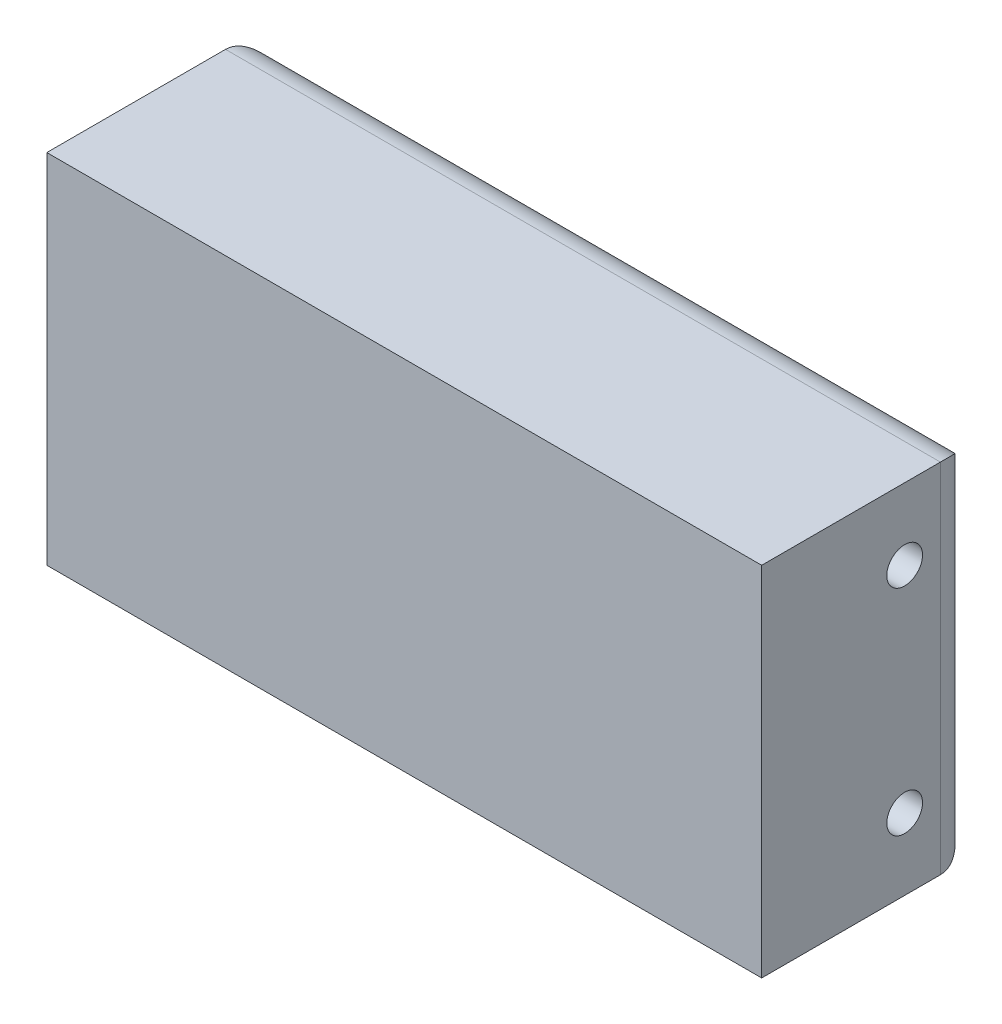
ISO-10303-21;
HEADER;
FILE_DESCRIPTION(('STEP AP214'),'2;1');
FILE_NAME('part.step','',(''),(''),'','','');
FILE_SCHEMA(('AUTOMOTIVE_DESIGN { 1 0 10303 214 1 1 1 1 }'));
ENDSEC;
DATA;
#1=APPLICATION_CONTEXT('core data for automotive mechanical design processes');
#2=APPLICATION_PROTOCOL_DEFINITION('international standard','automotive_design',2000,#1);
#3=PRODUCT_CONTEXT('',#1,'mechanical');
#4=PRODUCT('Part','Part','',(#3));
#5=PRODUCT_RELATED_PRODUCT_CATEGORY('part','',(#4));
#6=PRODUCT_DEFINITION_FORMATION('','',#4);
#7=PRODUCT_DEFINITION_CONTEXT('part definition',#1,'design');
#8=PRODUCT_DEFINITION('design','',#6,#7);
#9=PRODUCT_DEFINITION_SHAPE('','',#8);
#10=(LENGTH_UNIT() NAMED_UNIT(*) SI_UNIT(.MILLI.,.METRE.));
#11=(NAMED_UNIT(*) PLANE_ANGLE_UNIT() SI_UNIT($,.RADIAN.));
#12=(NAMED_UNIT(*) SI_UNIT($,.STERADIAN.) SOLID_ANGLE_UNIT());
#13=UNCERTAINTY_MEASURE_WITH_UNIT(LENGTH_MEASURE(1.E-05),#10,'distance_accuracy_value','');
#14=(GEOMETRIC_REPRESENTATION_CONTEXT(3) GLOBAL_UNCERTAINTY_ASSIGNED_CONTEXT((#13)) GLOBAL_UNIT_ASSIGNED_CONTEXT((#10,
#11,#12)) REPRESENTATION_CONTEXT('',''));
#15=CARTESIAN_POINT('',(0.,0.,0.));
#16=DIRECTION('',(0.,0.,1.));
#17=DIRECTION('',(1.,0.,0.));
#18=AXIS2_PLACEMENT_3D('',#15,#16,#17);
#19=CARTESIAN_POINT('',(50.,25.,30.));
#20=DIRECTION('',(-1.,0.,0.));
#21=DIRECTION('',(0.,-1.,0.));
#22=AXIS2_PLACEMENT_3D('',#19,#20,#21);
#23=PLANE('',#22);
#24=CARTESIAN_POINT('',(50.,-15.,10.));
#25=DIRECTION('',(1.,0.,0.));
#26=DIRECTION('',(0.,1.,0.));
#27=AXIS2_PLACEMENT_3D('',#24,#25,#26);
#28=CIRCLE('',#27,2.5);
#29=CARTESIAN_POINT('',(50.,-12.5,10.));
#30=VERTEX_POINT('',#29);
#31=EDGE_CURVE('E134',#30,#30,#28,.T.);
#32=ORIENTED_EDGE('',*,*,#31,.F.);
#33=EDGE_LOOP('',(#32));
#34=FACE_BOUND('',#33,.T.);
#35=CARTESIAN_POINT('',(50.,15.,10.));
#36=DIRECTION('',(1.,0.,0.));
#37=DIRECTION('',(0.,1.,0.));
#38=AXIS2_PLACEMENT_3D('',#35,#36,#37);
#39=CIRCLE('',#38,2.5);
#40=CARTESIAN_POINT('',(50.,17.5,10.));
#41=VERTEX_POINT('',#40);
#42=EDGE_CURVE('E133',#41,#41,#39,.T.);
#43=ORIENTED_EDGE('',*,*,#42,.F.);
#44=EDGE_LOOP('',(#43));
#45=FACE_BOUND('',#44,.T.);
#46=DIRECTION('',(0.,0.,-1.));
#47=VECTOR('',#46,1.);
#48=CARTESIAN_POINT('',(50.,-25.,30.));
#49=LINE('',#48,#47);
#50=CARTESIAN_POINT('',(50.,-25.,30.));
#51=VERTEX_POINT('',#50);
#52=CARTESIAN_POINT('',(50.,-25.,5.));
#53=VERTEX_POINT('',#52);
#54=EDGE_CURVE('E151',#51,#53,#49,.T.);
#55=ORIENTED_EDGE('',*,*,#54,.T.);
#56=DIRECTION('',(0.,1.,0.));
#57=VECTOR('',#56,1.);
#58=CARTESIAN_POINT('',(50.,25.,5.));
#59=LINE('',#58,#57);
#60=CARTESIAN_POINT('',(50.,25.,5.));
#61=VERTEX_POINT('',#60);
#62=EDGE_CURVE('E163',#53,#61,#59,.T.);
#63=ORIENTED_EDGE('',*,*,#62,.T.);
#64=DIRECTION('',(0.,0.,-1.));
#65=VECTOR('',#64,1.);
#66=CARTESIAN_POINT('',(50.,25.,30.));
#67=LINE('',#66,#65);
#68=CARTESIAN_POINT('',(50.,25.,30.));
#69=VERTEX_POINT('',#68);
#70=EDGE_CURVE('E160',#69,#61,#67,.T.);
#71=ORIENTED_EDGE('',*,*,#70,.F.);
#72=DIRECTION('',(0.,1.,0.));
#73=VECTOR('',#72,1.);
#74=CARTESIAN_POINT('',(50.,25.,30.));
#75=LINE('',#74,#73);
#76=EDGE_CURVE('E140',#51,#69,#75,.T.);
#77=ORIENTED_EDGE('',*,*,#76,.F.);
#78=EDGE_LOOP('',(#55,#63,#71,#77));
#79=FACE_BOUND('',#78,.T.);
#80=ADVANCED_FACE('F35',(#34,#45,#79),#23,.F.);
#81=CARTESIAN_POINT('',(-50.,25.,30.));
#82=DIRECTION('',(0.,-1.,0.));
#83=DIRECTION('',(0.,0.,-1.));
#84=AXIS2_PLACEMENT_3D('',#81,#82,#83);
#85=PLANE('',#84);
#86=ORIENTED_EDGE('',*,*,#70,.T.);
#87=DIRECTION('',(-1.,0.,0.));
#88=VECTOR('',#87,1.);
#89=CARTESIAN_POINT('',(-50.,25.,5.));
#90=LINE('',#89,#88);
#91=CARTESIAN_POINT('',(-50.,25.,5.));
#92=VERTEX_POINT('',#91);
#93=EDGE_CURVE('E11',#61,#92,#90,.T.);
#94=ORIENTED_EDGE('',*,*,#93,.T.);
#95=DIRECTION('',(0.,0.,-1.));
#96=VECTOR('',#95,1.);
#97=CARTESIAN_POINT('',(-50.,25.,30.));
#98=LINE('',#97,#96);
#99=CARTESIAN_POINT('',(-50.,25.,30.));
#100=VERTEX_POINT('',#99);
#101=EDGE_CURVE('E157',#100,#92,#98,.T.);
#102=ORIENTED_EDGE('',*,*,#101,.F.);
#103=DIRECTION('',(-1.,0.,0.));
#104=VECTOR('',#103,1.);
#105=CARTESIAN_POINT('',(-50.,25.,30.));
#106=LINE('',#105,#104);
#107=EDGE_CURVE('E145',#69,#100,#106,.T.);
#108=ORIENTED_EDGE('',*,*,#107,.F.);
#109=EDGE_LOOP('',(#86,#94,#102,#108));
#110=FACE_BOUND('',#109,.T.);
#111=ADVANCED_FACE('F210',(#110),#85,.F.);
#112=CARTESIAN_POINT('',(-50.,25.,30.));
#113=DIRECTION('',(1.,0.,0.));
#114=DIRECTION('',(0.,1.,0.));
#115=AXIS2_PLACEMENT_3D('',#112,#113,#114);
#116=PLANE('',#115);
#117=CARTESIAN_POINT('',(-50.,-15.,10.));
#118=DIRECTION('',(1.,0.,0.));
#119=DIRECTION('',(0.,1.,0.));
#120=AXIS2_PLACEMENT_3D('',#117,#118,#119);
#121=CIRCLE('',#120,2.5);
#122=CARTESIAN_POINT('',(-50.,-12.5,10.));
#123=VERTEX_POINT('',#122);
#124=EDGE_CURVE('E130',#123,#123,#121,.T.);
#125=ORIENTED_EDGE('',*,*,#124,.T.);
#126=EDGE_LOOP('',(#125));
#127=FACE_BOUND('',#126,.T.);
#128=CARTESIAN_POINT('',(-50.,15.,10.));
#129=DIRECTION('',(1.,0.,0.));
#130=DIRECTION('',(0.,1.,0.));
#131=AXIS2_PLACEMENT_3D('',#128,#129,#130);
#132=CIRCLE('',#131,2.5);
#133=CARTESIAN_POINT('',(-50.,17.5,10.));
#134=VERTEX_POINT('',#133);
#135=EDGE_CURVE('E137',#134,#134,#132,.T.);
#136=ORIENTED_EDGE('',*,*,#135,.T.);
#137=EDGE_LOOP('',(#136));
#138=FACE_BOUND('',#137,.T.);
#139=ORIENTED_EDGE('',*,*,#101,.T.);
#140=DIRECTION('',(0.,-1.,0.));
#141=VECTOR('',#140,1.);
#142=CARTESIAN_POINT('',(-50.,25.,5.));
#143=LINE('',#142,#141);
#144=CARTESIAN_POINT('',(-50.,-25.,5.));
#145=VERTEX_POINT('',#144);
#146=EDGE_CURVE('E44',#92,#145,#143,.T.);
#147=ORIENTED_EDGE('',*,*,#146,.T.);
#148=DIRECTION('',(0.,0.,-1.));
#149=VECTOR('',#148,1.);
#150=CARTESIAN_POINT('',(-50.,-25.,30.));
#151=LINE('',#150,#149);
#152=CARTESIAN_POINT('',(-50.,-25.,30.));
#153=VERTEX_POINT('',#152);
#154=EDGE_CURVE('E154',#153,#145,#151,.T.);
#155=ORIENTED_EDGE('',*,*,#154,.F.);
#156=DIRECTION('',(0.,-1.,0.));
#157=VECTOR('',#156,1.);
#158=CARTESIAN_POINT('',(-50.,25.,30.));
#159=LINE('',#158,#157);
#160=EDGE_CURVE('E147',#100,#153,#159,.T.);
#161=ORIENTED_EDGE('',*,*,#160,.F.);
#162=EDGE_LOOP('',(#139,#147,#155,#161));
#163=FACE_BOUND('',#162,.T.);
#164=ADVANCED_FACE('F219',(#127,#138,#163),#116,.F.);
#165=CARTESIAN_POINT('',(-50.,-25.,30.));
#166=DIRECTION('',(0.,1.,0.));
#167=DIRECTION('',(0.,0.,1.));
#168=AXIS2_PLACEMENT_3D('',#165,#166,#167);
#169=PLANE('',#168);
#170=ORIENTED_EDGE('',*,*,#154,.T.);
#171=DIRECTION('',(1.,0.,0.));
#172=VECTOR('',#171,1.);
#173=CARTESIAN_POINT('',(-50.,-25.,5.));
#174=LINE('',#173,#172);
#175=EDGE_CURVE('E175',#145,#53,#174,.T.);
#176=ORIENTED_EDGE('',*,*,#175,.T.);
#177=ORIENTED_EDGE('',*,*,#54,.F.);
#178=DIRECTION('',(1.,0.,0.));
#179=VECTOR('',#178,1.);
#180=CARTESIAN_POINT('',(-50.,-25.,30.));
#181=LINE('',#180,#179);
#182=EDGE_CURVE('E149',#153,#51,#181,.T.);
#183=ORIENTED_EDGE('',*,*,#182,.F.);
#184=EDGE_LOOP('',(#170,#176,#177,#183));
#185=FACE_BOUND('',#184,.T.);
#186=ADVANCED_FACE('F217',(#185),#169,.F.);
#187=CARTESIAN_POINT('',(0.,0.,30.));
#188=DIRECTION('',(0.,0.,1.));
#189=DIRECTION('',(1.,0.,0.));
#190=AXIS2_PLACEMENT_3D('',#187,#188,#189);
#191=PLANE('',#190);
#192=ORIENTED_EDGE('',*,*,#76,.T.);
#193=ORIENTED_EDGE('',*,*,#107,.T.);
#194=ORIENTED_EDGE('',*,*,#160,.T.);
#195=ORIENTED_EDGE('',*,*,#182,.T.);
#196=EDGE_LOOP('',(#192,#193,#194,#195));
#197=FACE_BOUND('',#196,.T.);
#198=ADVANCED_FACE('F213',(#197),#191,.T.);
#199=CARTESIAN_POINT('',(0.,0.,0.));
#200=DIRECTION('',(0.,0.,1.));
#201=DIRECTION('',(1.,0.,0.));
#202=AXIS2_PLACEMENT_3D('',#199,#200,#201);
#203=PLANE('',#202);
#204=CARTESIAN_POINT('',(0.,15.,0.));
#205=DIRECTION('',(0.,0.,-1.));
#206=DIRECTION('',(-1.,0.,0.));
#207=AXIS2_PLACEMENT_3D('',#204,#205,#206);
#208=CIRCLE('',#207,2.5);
#209=CARTESIAN_POINT('',(-2.49999999999998,15.,0.));
#210=VERTEX_POINT('',#209);
#211=EDGE_CURVE('E111',#210,#210,#208,.T.);
#212=ORIENTED_EDGE('',*,*,#211,.F.);
#213=EDGE_LOOP('',(#212));
#214=FACE_BOUND('',#213,.T.);
#215=CARTESIAN_POINT('',(-30.,15.,0.));
#216=DIRECTION('',(0.,0.,-1.));
#217=DIRECTION('',(-1.,0.,0.));
#218=AXIS2_PLACEMENT_3D('',#215,#216,#217);
#219=CIRCLE('',#218,2.5);
#220=CARTESIAN_POINT('',(-32.5,15.,0.));
#221=VERTEX_POINT('',#220);
#222=EDGE_CURVE('E117',#221,#221,#219,.T.);
#223=ORIENTED_EDGE('',*,*,#222,.F.);
#224=EDGE_LOOP('',(#223));
#225=FACE_BOUND('',#224,.T.);
#226=CARTESIAN_POINT('',(30.,15.,0.));
#227=DIRECTION('',(0.,0.,-1.));
#228=DIRECTION('',(-1.,0.,0.));
#229=AXIS2_PLACEMENT_3D('',#226,#227,#228);
#230=CIRCLE('',#229,2.5);
#231=CARTESIAN_POINT('',(27.5,15.,0.));
#232=VERTEX_POINT('',#231);
#233=EDGE_CURVE('E123',#232,#232,#230,.T.);
#234=ORIENTED_EDGE('',*,*,#233,.F.);
#235=EDGE_LOOP('',(#234));
#236=FACE_BOUND('',#235,.T.);
#237=DIRECTION('',(-1.,0.,0.));
#238=VECTOR('',#237,1.);
#239=CARTESIAN_POINT('',(0.,20.,0.));
#240=LINE('',#239,#238);
#241=CARTESIAN_POINT('',(-45.,20.,0.));
#242=VERTEX_POINT('',#241);
#243=CARTESIAN_POINT('',(45.,20.,0.));
#244=VERTEX_POINT('',#243);
#245=EDGE_CURVE('E166',#242,#244,#240,.F.);
#246=ORIENTED_EDGE('',*,*,#245,.T.);
#247=DIRECTION('',(0.,1.,0.));
#248=VECTOR('',#247,1.);
#249=CARTESIAN_POINT('',(45.,0.,0.));
#250=LINE('',#249,#248);
#251=CARTESIAN_POINT('',(45.,-20.,0.));
#252=VERTEX_POINT('',#251);
#253=EDGE_CURVE('E172',#244,#252,#250,.F.);
#254=ORIENTED_EDGE('',*,*,#253,.T.);
#255=DIRECTION('',(1.,0.,0.));
#256=VECTOR('',#255,1.);
#257=CARTESIAN_POINT('',(0.,-20.,0.));
#258=LINE('',#257,#256);
#259=CARTESIAN_POINT('',(-45.,-20.,0.));
#260=VERTEX_POINT('',#259);
#261=EDGE_CURVE('E170',#252,#260,#258,.F.);
#262=ORIENTED_EDGE('',*,*,#261,.T.);
#263=DIRECTION('',(0.,-1.,0.));
#264=VECTOR('',#263,1.);
#265=CARTESIAN_POINT('',(-45.,0.,0.));
#266=LINE('',#265,#264);
#267=EDGE_CURVE('E168',#260,#242,#266,.F.);
#268=ORIENTED_EDGE('',*,*,#267,.T.);
#269=EDGE_LOOP('',(#246,#254,#262,#268));
#270=FACE_BOUND('',#269,.T.);
#271=ADVANCED_FACE('F197',(#214,#225,#236,#270),#203,.F.);
#272=CARTESIAN_POINT('',(-50.,15.,10.));
#273=DIRECTION('',(1.,0.,0.));
#274=DIRECTION('',(0.,1.,0.));
#275=AXIS2_PLACEMENT_3D('',#272,#273,#274);
#276=CYLINDRICAL_SURFACE('',#275,2.5);
#277=CARTESIAN_POINT('',(0.,15.,10.));
#278=DIRECTION('',(-0.707106781186547,0.,-0.707106781186547));
#279=DIRECTION('',(0.707106781186547,0.,-0.707106781186547));
#280=AXIS2_PLACEMENT_3D('',#277,#278,#279);
#281=ELLIPSE('',#280,3.53553390593274,2.5);
#282=CARTESIAN_POINT('',(0.,12.5,10.));
#283=VERTEX_POINT('',#282);
#284=CARTESIAN_POINT('',(0.,17.5,10.));
#285=VERTEX_POINT('',#284);
#286=EDGE_CURVE('E104',#283,#285,#281,.F.);
#287=ORIENTED_EDGE('',*,*,#286,.F.);
#288=CARTESIAN_POINT('',(0.,15.,10.));
#289=DIRECTION('',(0.707106781186547,0.,-0.707106781186547));
#290=DIRECTION('',(-0.707106781186547,0.,-0.707106781186547));
#291=AXIS2_PLACEMENT_3D('',#288,#289,#290);
#292=ELLIPSE('',#291,3.53553390593274,2.5);
#293=EDGE_CURVE('E51',#285,#283,#292,.F.);
#294=ORIENTED_EDGE('',*,*,#293,.F.);
#295=EDGE_LOOP('',(#287,#294));
#296=FACE_BOUND('',#295,.T.);
#297=CARTESIAN_POINT('',(-30.,15.,10.));
#298=DIRECTION('',(-0.707106781186547,0.,-0.707106781186547));
#299=DIRECTION('',(0.707106781186547,0.,-0.707106781186547));
#300=AXIS2_PLACEMENT_3D('',#297,#298,#299);
#301=ELLIPSE('',#300,3.53553390593274,2.5);
#302=CARTESIAN_POINT('',(-30.,12.5,10.));
#303=VERTEX_POINT('',#302);
#304=CARTESIAN_POINT('',(-30.,17.5,10.));
#305=VERTEX_POINT('',#304);
#306=EDGE_CURVE('E114',#303,#305,#301,.F.);
#307=ORIENTED_EDGE('',*,*,#306,.F.);
#308=CARTESIAN_POINT('',(-30.,15.,10.));
#309=DIRECTION('',(0.707106781186547,0.,-0.707106781186547));
#310=DIRECTION('',(-0.707106781186547,0.,-0.707106781186547));
#311=AXIS2_PLACEMENT_3D('',#308,#309,#310);
#312=ELLIPSE('',#311,3.53553390593274,2.5);
#313=EDGE_CURVE('E58',#305,#303,#312,.F.);
#314=ORIENTED_EDGE('',*,*,#313,.F.);
#315=EDGE_LOOP('',(#307,#314));
#316=FACE_BOUND('',#315,.T.);
#317=CARTESIAN_POINT('',(30.,15.,10.));
#318=DIRECTION('',(-0.707106781186547,0.,-0.707106781186547));
#319=DIRECTION('',(0.707106781186547,0.,-0.707106781186547));
#320=AXIS2_PLACEMENT_3D('',#317,#318,#319);
#321=ELLIPSE('',#320,3.53553390593274,2.5);
#322=CARTESIAN_POINT('',(30.,12.5,10.));
#323=VERTEX_POINT('',#322);
#324=CARTESIAN_POINT('',(30.,17.5,10.));
#325=VERTEX_POINT('',#324);
#326=EDGE_CURVE('E120',#323,#325,#321,.F.);
#327=ORIENTED_EDGE('',*,*,#326,.F.);
#328=CARTESIAN_POINT('',(30.,15.,10.));
#329=DIRECTION('',(0.707106781186547,0.,-0.707106781186547));
#330=DIRECTION('',(-0.707106781186547,0.,-0.707106781186547));
#331=AXIS2_PLACEMENT_3D('',#328,#329,#330);
#332=ELLIPSE('',#331,3.53553390593274,2.5);
#333=EDGE_CURVE('E127',#325,#323,#332,.F.);
#334=ORIENTED_EDGE('',*,*,#333,.F.);
#335=EDGE_LOOP('',(#327,#334));
#336=FACE_BOUND('',#335,.T.);
#337=ORIENTED_EDGE('',*,*,#135,.F.);
#338=EDGE_LOOP('',(#337));
#339=FACE_BOUND('',#338,.T.);
#340=ORIENTED_EDGE('',*,*,#42,.T.);
#341=EDGE_LOOP('',(#340));
#342=FACE_BOUND('',#341,.T.);
#343=ADVANCED_FACE('F109',(#296,#316,#336,#339,#342),#276,.F.);
#344=CARTESIAN_POINT('',(-50.,-15.,10.));
#345=DIRECTION('',(1.,0.,0.));
#346=DIRECTION('',(0.,1.,0.));
#347=AXIS2_PLACEMENT_3D('',#344,#345,#346);
#348=CYLINDRICAL_SURFACE('',#347,2.5);
#349=ORIENTED_EDGE('',*,*,#124,.F.);
#350=EDGE_LOOP('',(#349));
#351=FACE_BOUND('',#350,.T.);
#352=ORIENTED_EDGE('',*,*,#31,.T.);
#353=EDGE_LOOP('',(#352));
#354=FACE_BOUND('',#353,.T.);
#355=ADVANCED_FACE('F246',(#351,#354),#348,.F.);
#356=CARTESIAN_POINT('',(-45.,25.,5.));
#357=DIRECTION('',(0.,-1.,0.));
#358=DIRECTION('',(1.,0.,0.));
#359=AXIS2_PLACEMENT_3D('',#356,#357,#358);
#360=CYLINDRICAL_SURFACE('',#359,5.);
#361=CARTESIAN_POINT('',(-45.,20.,5.));
#362=DIRECTION('',(-0.707106781186547,-0.707106781186548,0.));
#363=DIRECTION('',(-0.707106781186548,0.707106781186547,0.));
#364=AXIS2_PLACEMENT_3D('',#361,#362,#363);
#365=ELLIPSE('',#364,7.07106781186548,5.);
#366=EDGE_CURVE('E180',#242,#92,#365,.F.);
#367=ORIENTED_EDGE('',*,*,#366,.F.);
#368=ORIENTED_EDGE('',*,*,#267,.F.);
#369=CARTESIAN_POINT('',(-45.,-20.,5.));
#370=DIRECTION('',(0.707106781186548,-0.707106781186547,0.));
#371=DIRECTION('',(-0.707106781186547,-0.707106781186548,0.));
#372=AXIS2_PLACEMENT_3D('',#369,#370,#371);
#373=ELLIPSE('',#372,7.07106781186547,5.);
#374=EDGE_CURVE('E39',#145,#260,#373,.T.);
#375=ORIENTED_EDGE('',*,*,#374,.F.);
#376=ORIENTED_EDGE('',*,*,#146,.F.);
#377=EDGE_LOOP('',(#367,#368,#375,#376));
#378=FACE_BOUND('',#377,.T.);
#379=ADVANCED_FACE('F37',(#378),#360,.T.);
#380=CARTESIAN_POINT('',(-50.,-20.,5.));
#381=DIRECTION('',(1.,0.,0.));
#382=DIRECTION('',(0.,0.,-1.));
#383=AXIS2_PLACEMENT_3D('',#380,#381,#382);
#384=CYLINDRICAL_SURFACE('',#383,5.);
#385=ORIENTED_EDGE('',*,*,#374,.T.);
#386=ORIENTED_EDGE('',*,*,#261,.F.);
#387=CARTESIAN_POINT('',(45.,-20.,5.));
#388=DIRECTION('',(0.707106781186547,0.707106781186548,0.));
#389=DIRECTION('',(0.707106781186548,-0.707106781186547,0.));
#390=AXIS2_PLACEMENT_3D('',#387,#388,#389);
#391=ELLIPSE('',#390,7.07106781186548,5.);
#392=EDGE_CURVE('E179',#53,#252,#391,.T.);
#393=ORIENTED_EDGE('',*,*,#392,.F.);
#394=ORIENTED_EDGE('',*,*,#175,.F.);
#395=EDGE_LOOP('',(#385,#386,#393,#394));
#396=FACE_BOUND('',#395,.T.);
#397=ADVANCED_FACE('F191',(#396),#384,.T.);
#398=CARTESIAN_POINT('',(-50.,20.,5.));
#399=DIRECTION('',(-1.,0.,0.));
#400=DIRECTION('',(0.,0.,1.));
#401=AXIS2_PLACEMENT_3D('',#398,#399,#400);
#402=CYLINDRICAL_SURFACE('',#401,5.);
#403=ORIENTED_EDGE('',*,*,#366,.T.);
#404=ORIENTED_EDGE('',*,*,#93,.F.);
#405=CARTESIAN_POINT('',(45.,20.,5.));
#406=DIRECTION('',(-0.707106781186548,0.707106781186547,0.));
#407=DIRECTION('',(-0.707106781186547,-0.707106781186548,0.));
#408=AXIS2_PLACEMENT_3D('',#405,#406,#407);
#409=ELLIPSE('',#408,7.07106781186547,5.);
#410=EDGE_CURVE('E126',#244,#61,#409,.F.);
#411=ORIENTED_EDGE('',*,*,#410,.F.);
#412=ORIENTED_EDGE('',*,*,#245,.F.);
#413=EDGE_LOOP('',(#403,#404,#411,#412));
#414=FACE_BOUND('',#413,.T.);
#415=ADVANCED_FACE('F203',(#414),#402,.T.);
#416=CARTESIAN_POINT('',(45.,25.,5.));
#417=DIRECTION('',(0.,1.,0.));
#418=DIRECTION('',(-1.,0.,0.));
#419=AXIS2_PLACEMENT_3D('',#416,#417,#418);
#420=CYLINDRICAL_SURFACE('',#419,5.);
#421=ORIENTED_EDGE('',*,*,#392,.T.);
#422=ORIENTED_EDGE('',*,*,#253,.F.);
#423=ORIENTED_EDGE('',*,*,#410,.T.);
#424=ORIENTED_EDGE('',*,*,#62,.F.);
#425=EDGE_LOOP('',(#421,#422,#423,#424));
#426=FACE_BOUND('',#425,.T.);
#427=ADVANCED_FACE('F201',(#426),#420,.T.);
#428=CARTESIAN_POINT('',(30.,15.,30.001));
#429=DIRECTION('',(0.,0.,-1.));
#430=DIRECTION('',(-1.,0.,0.));
#431=AXIS2_PLACEMENT_3D('',#428,#429,#430);
#432=CYLINDRICAL_SURFACE('',#431,2.5);
#433=ORIENTED_EDGE('',*,*,#333,.T.);
#434=ORIENTED_EDGE('',*,*,#326,.T.);
#435=EDGE_LOOP('',(#433,#434));
#436=FACE_BOUND('',#435,.T.);
#437=ORIENTED_EDGE('',*,*,#233,.T.);
#438=EDGE_LOOP('',(#437));
#439=FACE_BOUND('',#438,.T.);
#440=ADVANCED_FACE('F240',(#436,#439),#432,.F.);
#441=CARTESIAN_POINT('',(-30.,15.,30.001));
#442=DIRECTION('',(0.,0.,-1.));
#443=DIRECTION('',(-1.,0.,0.));
#444=AXIS2_PLACEMENT_3D('',#441,#442,#443);
#445=CYLINDRICAL_SURFACE('',#444,2.5);
#446=ORIENTED_EDGE('',*,*,#313,.T.);
#447=ORIENTED_EDGE('',*,*,#306,.T.);
#448=EDGE_LOOP('',(#446,#447));
#449=FACE_BOUND('',#448,.T.);
#450=ORIENTED_EDGE('',*,*,#222,.T.);
#451=EDGE_LOOP('',(#450));
#452=FACE_BOUND('',#451,.T.);
#453=ADVANCED_FACE('F274',(#449,#452),#445,.F.);
#454=CARTESIAN_POINT('',(0.,15.,30.001));
#455=DIRECTION('',(0.,0.,-1.));
#456=DIRECTION('',(-1.,0.,0.));
#457=AXIS2_PLACEMENT_3D('',#454,#455,#456);
#458=CYLINDRICAL_SURFACE('',#457,2.5);
#459=ORIENTED_EDGE('',*,*,#293,.T.);
#460=ORIENTED_EDGE('',*,*,#286,.T.);
#461=EDGE_LOOP('',(#459,#460));
#462=FACE_BOUND('',#461,.T.);
#463=ORIENTED_EDGE('',*,*,#211,.T.);
#464=EDGE_LOOP('',(#463));
#465=FACE_BOUND('',#464,.T.);
#466=ADVANCED_FACE('F105',(#462,#465),#458,.F.);
#467=CLOSED_SHELL('',(#80,#111,#164,#186,#198,#271,#343,#355,#379,#397,#415,#427,#440,#453,#466));
#468=MANIFOLD_SOLID_BREP('B2',#467);
#469=ADVANCED_BREP_SHAPE_REPRESENTATION('',(#18,#468),#14);
#470=SHAPE_DEFINITION_REPRESENTATION(#9,#469);
ENDSEC;
END-ISO-10303-21;
